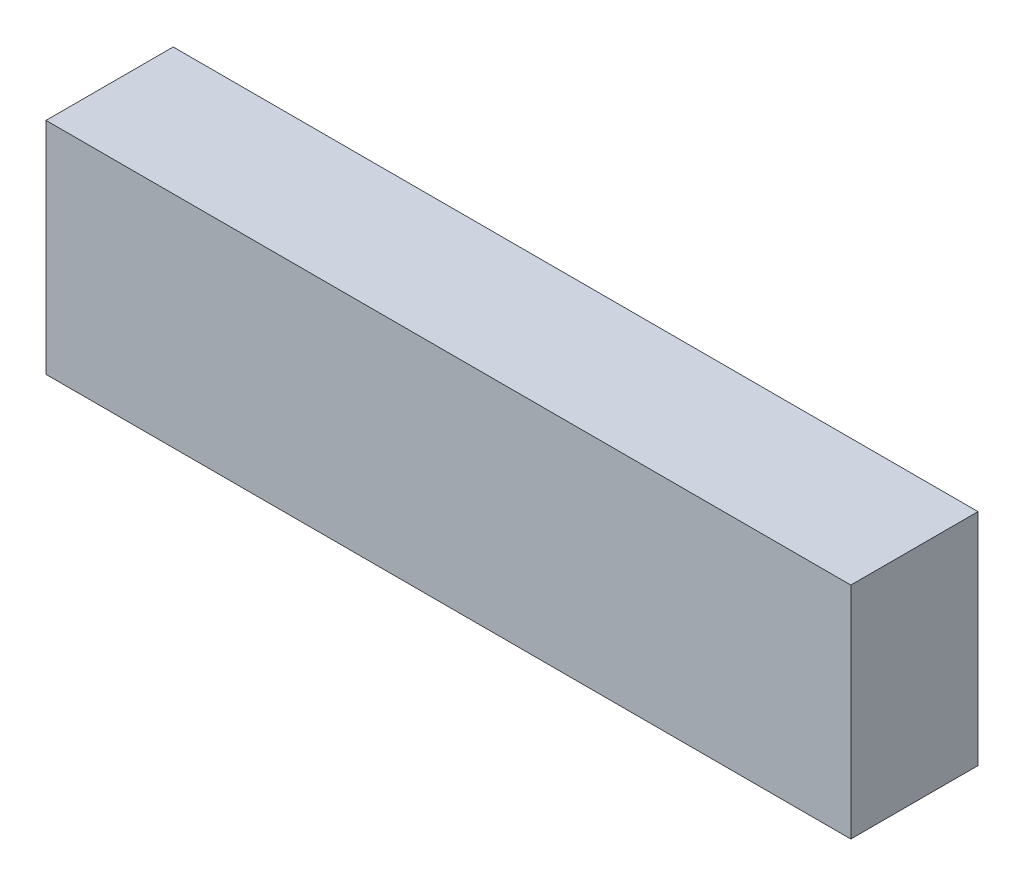
ISO-10303-21;
HEADER;
FILE_DESCRIPTION(('STEP AP214'),'2;1');
FILE_NAME('part.step','',(''),(''),'','','');
FILE_SCHEMA(('AUTOMOTIVE_DESIGN { 1 0 10303 214 1 1 1 1 }'));
ENDSEC;
DATA;
#1=APPLICATION_CONTEXT('core data for automotive mechanical design processes');
#2=APPLICATION_PROTOCOL_DEFINITION('international standard','automotive_design',2000,#1);
#3=PRODUCT_CONTEXT('',#1,'mechanical');
#4=PRODUCT('Part','Part','',(#3));
#5=PRODUCT_RELATED_PRODUCT_CATEGORY('part','',(#4));
#6=PRODUCT_DEFINITION_FORMATION('','',#4);
#7=PRODUCT_DEFINITION_CONTEXT('part definition',#1,'design');
#8=PRODUCT_DEFINITION('design','',#6,#7);
#9=PRODUCT_DEFINITION_SHAPE('','',#8);
#10=(LENGTH_UNIT() NAMED_UNIT(*) SI_UNIT(.MILLI.,.METRE.));
#11=(NAMED_UNIT(*) PLANE_ANGLE_UNIT() SI_UNIT($,.RADIAN.));
#12=(NAMED_UNIT(*) SI_UNIT($,.STERADIAN.) SOLID_ANGLE_UNIT());
#13=UNCERTAINTY_MEASURE_WITH_UNIT(LENGTH_MEASURE(1.E-05),#10,'distance_accuracy_value','');
#14=(GEOMETRIC_REPRESENTATION_CONTEXT(3) GLOBAL_UNCERTAINTY_ASSIGNED_CONTEXT((#13)) GLOBAL_UNIT_ASSIGNED_CONTEXT((#10,
#11,#12)) REPRESENTATION_CONTEXT('',''));
#15=CARTESIAN_POINT('',(0.,0.,0.));
#16=DIRECTION('',(0.,0.,1.));
#17=DIRECTION('',(1.,0.,0.));
#18=AXIS2_PLACEMENT_3D('',#15,#16,#17);
#19=CARTESIAN_POINT('',(7.86450000000038,30.19,7.25));
#20=DIRECTION('',(1.,0.,0.));
#21=DIRECTION('',(0.,1.,0.));
#22=AXIS2_PLACEMENT_3D('',#19,#20,#21);
#23=PLANE('',#22);
#24=DIRECTION('',(0.,-1.,0.));
#25=VECTOR('',#24,1.);
#26=CARTESIAN_POINT('',(7.86450000000038,30.19,0.));
#27=LINE('',#26,#25);
#28=CARTESIAN_POINT('',(7.86450000000038,30.19,0.));
#29=VERTEX_POINT('',#28);
#30=CARTESIAN_POINT('',(7.86450000000038,17.65,0.));
#31=VERTEX_POINT('',#30);
#32=EDGE_CURVE('E149',#29,#31,#27,.T.);
#33=ORIENTED_EDGE('',*,*,#32,.T.);
#34=DIRECTION('',(0.,0.,-1.));
#35=VECTOR('',#34,1.);
#36=CARTESIAN_POINT('',(7.86450000000038,17.65,7.25));
#37=LINE('',#36,#35);
#38=CARTESIAN_POINT('',(7.86450000000038,17.65,7.25));
#39=VERTEX_POINT('',#38);
#40=EDGE_CURVE('E11',#39,#31,#37,.T.);
#41=ORIENTED_EDGE('',*,*,#40,.F.);
#42=DIRECTION('',(0.,-1.,0.));
#43=VECTOR('',#42,1.);
#44=CARTESIAN_POINT('',(7.86450000000038,30.19,7.25));
#45=LINE('',#44,#43);
#46=CARTESIAN_POINT('',(7.86450000000038,30.19,7.25));
#47=VERTEX_POINT('',#46);
#48=EDGE_CURVE('E140',#47,#39,#45,.T.);
#49=ORIENTED_EDGE('',*,*,#48,.F.);
#50=DIRECTION('',(0.,0.,-1.));
#51=VECTOR('',#50,1.);
#52=CARTESIAN_POINT('',(7.86450000000038,30.19,7.25));
#53=LINE('',#52,#51);
#54=EDGE_CURVE('E55',#47,#29,#53,.T.);
#55=ORIENTED_EDGE('',*,*,#54,.T.);
#56=EDGE_LOOP('',(#33,#41,#49,#55));
#57=FACE_BOUND('',#56,.T.);
#58=ADVANCED_FACE('F32',(#57),#23,.F.);
#59=CARTESIAN_POINT('',(7.86450000000038,17.65,7.25));
#60=DIRECTION('',(0.,1.,0.));
#61=DIRECTION('',(0.,0.,1.));
#62=AXIS2_PLACEMENT_3D('',#59,#60,#61);
#63=PLANE('',#62);
#64=DIRECTION('',(1.,0.,0.));
#65=VECTOR('',#64,1.);
#66=CARTESIAN_POINT('',(7.86450000000038,17.65,0.));
#67=LINE('',#66,#65);
#68=CARTESIAN_POINT('',(53.7445000000004,17.65,0.));
#69=VERTEX_POINT('',#68);
#70=EDGE_CURVE('E151',#31,#69,#67,.T.);
#71=ORIENTED_EDGE('',*,*,#70,.T.);
#72=DIRECTION('',(0.,0.,-1.));
#73=VECTOR('',#72,1.);
#74=CARTESIAN_POINT('',(53.7445000000004,17.65,7.25));
#75=LINE('',#74,#73);
#76=CARTESIAN_POINT('',(53.7445000000004,17.65,7.25));
#77=VERTEX_POINT('',#76);
#78=EDGE_CURVE('E39',#77,#69,#75,.T.);
#79=ORIENTED_EDGE('',*,*,#78,.F.);
#80=DIRECTION('',(1.,0.,0.));
#81=VECTOR('',#80,1.);
#82=CARTESIAN_POINT('',(7.86450000000038,17.65,7.25));
#83=LINE('',#82,#81);
#84=EDGE_CURVE('E81',#39,#77,#83,.T.);
#85=ORIENTED_EDGE('',*,*,#84,.F.);
#86=ORIENTED_EDGE('',*,*,#40,.T.);
#87=EDGE_LOOP('',(#71,#79,#85,#86));
#88=FACE_BOUND('',#87,.T.);
#89=ADVANCED_FACE('F166',(#88),#63,.F.);
#90=CARTESIAN_POINT('',(53.7445000000004,30.19,7.25));
#91=DIRECTION('',(1.,0.,0.));
#92=DIRECTION('',(0.,0.,-1.));
#93=AXIS2_PLACEMENT_3D('',#90,#91,#92);
#94=PLANE('',#93);
#95=DIRECTION('',(0.,-1.,0.));
#96=VECTOR('',#95,1.);
#97=CARTESIAN_POINT('',(53.7445000000004,30.19,0.));
#98=LINE('',#97,#96);
#99=CARTESIAN_POINT('',(53.7445000000004,30.19,0.));
#100=VERTEX_POINT('',#99);
#101=EDGE_CURVE('E155',#100,#69,#98,.T.);
#102=ORIENTED_EDGE('',*,*,#101,.F.);
#103=DIRECTION('',(0.,0.,-1.));
#104=VECTOR('',#103,1.);
#105=CARTESIAN_POINT('',(53.7445000000004,30.19,7.25));
#106=LINE('',#105,#104);
#107=CARTESIAN_POINT('',(53.7445000000004,30.19,7.25));
#108=VERTEX_POINT('',#107);
#109=EDGE_CURVE('E161',#108,#100,#106,.T.);
#110=ORIENTED_EDGE('',*,*,#109,.F.);
#111=DIRECTION('',(0.,-1.,0.));
#112=VECTOR('',#111,1.);
#113=CARTESIAN_POINT('',(53.7445000000004,30.19,7.25));
#114=LINE('',#113,#112);
#115=EDGE_CURVE('E144',#108,#77,#114,.T.);
#116=ORIENTED_EDGE('',*,*,#115,.T.);
#117=ORIENTED_EDGE('',*,*,#78,.T.);
#118=EDGE_LOOP('',(#102,#110,#116,#117));
#119=FACE_BOUND('',#118,.T.);
#120=ADVANCED_FACE('F164',(#119),#94,.T.);
#121=CARTESIAN_POINT('',(7.86450000000038,30.19,7.25));
#122=DIRECTION('',(0.,1.,0.));
#123=DIRECTION('',(0.,0.,1.));
#124=AXIS2_PLACEMENT_3D('',#121,#122,#123);
#125=PLANE('',#124);
#126=DIRECTION('',(1.,0.,0.));
#127=VECTOR('',#126,1.);
#128=CARTESIAN_POINT('',(7.86450000000038,30.19,0.));
#129=LINE('',#128,#127);
#130=EDGE_CURVE('E142',#29,#100,#129,.T.);
#131=ORIENTED_EDGE('',*,*,#130,.F.);
#132=ORIENTED_EDGE('',*,*,#54,.F.);
#133=DIRECTION('',(1.,0.,0.));
#134=VECTOR('',#133,1.);
#135=CARTESIAN_POINT('',(7.86450000000038,30.19,7.25));
#136=LINE('',#135,#134);
#137=EDGE_CURVE('E147',#47,#108,#136,.T.);
#138=ORIENTED_EDGE('',*,*,#137,.T.);
#139=ORIENTED_EDGE('',*,*,#109,.T.);
#140=EDGE_LOOP('',(#131,#132,#138,#139));
#141=FACE_BOUND('',#140,.T.);
#142=ADVANCED_FACE('F170',(#141),#125,.T.);
#143=CARTESIAN_POINT('',(0.,0.,7.25));
#144=DIRECTION('',(0.,0.,1.));
#145=DIRECTION('',(1.,0.,0.));
#146=AXIS2_PLACEMENT_3D('',#143,#144,#145);
#147=PLANE('',#146);
#148=ORIENTED_EDGE('',*,*,#48,.T.);
#149=ORIENTED_EDGE('',*,*,#84,.T.);
#150=ORIENTED_EDGE('',*,*,#115,.F.);
#151=ORIENTED_EDGE('',*,*,#137,.F.);
#152=EDGE_LOOP('',(#148,#149,#150,#151));
#153=FACE_BOUND('',#152,.T.);
#154=ADVANCED_FACE('F173',(#153),#147,.T.);
#155=CARTESIAN_POINT('',(0.,0.,0.));
#156=DIRECTION('',(0.,0.,1.));
#157=DIRECTION('',(1.,0.,0.));
#158=AXIS2_PLACEMENT_3D('',#155,#156,#157);
#159=PLANE('',#158);
#160=DIRECTION('',(1.,0.,0.));
#161=VECTOR('',#160,1.);
#162=CARTESIAN_POINT('',(7.86450000000038,29.69,0.));
#163=LINE('',#162,#161);
#164=CARTESIAN_POINT('',(8.36450000000038,29.69,0.));
#165=VERTEX_POINT('',#164);
#166=CARTESIAN_POINT('',(53.2445000000004,29.69,0.));
#167=VERTEX_POINT('',#166);
#168=EDGE_CURVE('E125',#165,#167,#163,.T.);
#169=ORIENTED_EDGE('',*,*,#168,.F.);
#170=DIRECTION('',(0.,-1.,0.));
#171=VECTOR('',#170,1.);
#172=CARTESIAN_POINT('',(8.36450000000038,30.19,0.));
#173=LINE('',#172,#171);
#174=CARTESIAN_POINT('',(8.36450000000038,18.15,0.));
#175=VERTEX_POINT('',#174);
#176=EDGE_CURVE('E112',#165,#175,#173,.T.);
#177=ORIENTED_EDGE('',*,*,#176,.T.);
#178=DIRECTION('',(1.,0.,0.));
#179=VECTOR('',#178,1.);
#180=CARTESIAN_POINT('',(7.86450000000038,18.15,0.));
#181=LINE('',#180,#179);
#182=CARTESIAN_POINT('',(53.2445000000004,18.15,0.));
#183=VERTEX_POINT('',#182);
#184=EDGE_CURVE('E135',#175,#183,#181,.T.);
#185=ORIENTED_EDGE('',*,*,#184,.T.);
#186=DIRECTION('',(0.,-1.,0.));
#187=VECTOR('',#186,1.);
#188=CARTESIAN_POINT('',(53.2445000000004,30.19,0.));
#189=LINE('',#188,#187);
#190=EDGE_CURVE('E46',#167,#183,#189,.T.);
#191=ORIENTED_EDGE('',*,*,#190,.F.);
#192=EDGE_LOOP('',(#169,#177,#185,#191));
#193=FACE_BOUND('',#192,.T.);
#194=ORIENTED_EDGE('',*,*,#32,.F.);
#195=ORIENTED_EDGE('',*,*,#130,.T.);
#196=ORIENTED_EDGE('',*,*,#101,.T.);
#197=ORIENTED_EDGE('',*,*,#70,.F.);
#198=EDGE_LOOP('',(#194,#195,#196,#197));
#199=FACE_BOUND('',#198,.T.);
#200=ADVANCED_FACE('F169',(#193,#199),#159,.F.);
#201=CARTESIAN_POINT('',(8.36450000000038,30.19,7.25));
#202=DIRECTION('',(1.,0.,0.));
#203=DIRECTION('',(0.,1.,0.));
#204=AXIS2_PLACEMENT_3D('',#201,#202,#203);
#205=PLANE('',#204);
#206=ORIENTED_EDGE('',*,*,#176,.F.);
#207=DIRECTION('',(0.,0.,-1.));
#208=VECTOR('',#207,1.);
#209=CARTESIAN_POINT('',(8.36450000000038,29.69,7.25));
#210=LINE('',#209,#208);
#211=CARTESIAN_POINT('',(8.36450000000038,29.69,7.05));
#212=VERTEX_POINT('',#211);
#213=EDGE_CURVE('E105',#212,#165,#210,.T.);
#214=ORIENTED_EDGE('',*,*,#213,.F.);
#215=DIRECTION('',(0.,-1.,0.));
#216=VECTOR('',#215,1.);
#217=CARTESIAN_POINT('',(8.36450000000038,30.19,7.05));
#218=LINE('',#217,#216);
#219=CARTESIAN_POINT('',(8.36450000000038,18.15,7.05));
#220=VERTEX_POINT('',#219);
#221=EDGE_CURVE('E109',#212,#220,#218,.T.);
#222=ORIENTED_EDGE('',*,*,#221,.T.);
#223=DIRECTION('',(0.,0.,-1.));
#224=VECTOR('',#223,1.);
#225=CARTESIAN_POINT('',(8.36450000000038,18.15,7.25));
#226=LINE('',#225,#224);
#227=EDGE_CURVE('E152',#220,#175,#226,.T.);
#228=ORIENTED_EDGE('',*,*,#227,.T.);
#229=EDGE_LOOP('',(#206,#214,#222,#228));
#230=FACE_BOUND('',#229,.T.);
#231=ADVANCED_FACE('F107',(#230),#205,.T.);
#232=CARTESIAN_POINT('',(7.86450000000038,18.15,7.25));
#233=DIRECTION('',(0.,1.,0.));
#234=DIRECTION('',(0.,0.,1.));
#235=AXIS2_PLACEMENT_3D('',#232,#233,#234);
#236=PLANE('',#235);
#237=ORIENTED_EDGE('',*,*,#184,.F.);
#238=ORIENTED_EDGE('',*,*,#227,.F.);
#239=DIRECTION('',(1.,0.,0.));
#240=VECTOR('',#239,1.);
#241=CARTESIAN_POINT('',(7.86450000000038,18.15,7.05));
#242=LINE('',#241,#240);
#243=CARTESIAN_POINT('',(53.2445000000004,18.15,7.05));
#244=VERTEX_POINT('',#243);
#245=EDGE_CURVE('E124',#220,#244,#242,.T.);
#246=ORIENTED_EDGE('',*,*,#245,.T.);
#247=DIRECTION('',(0.,0.,-1.));
#248=VECTOR('',#247,1.);
#249=CARTESIAN_POINT('',(53.2445000000004,18.15,7.25));
#250=LINE('',#249,#248);
#251=EDGE_CURVE('E264',#244,#183,#250,.T.);
#252=ORIENTED_EDGE('',*,*,#251,.T.);
#253=EDGE_LOOP('',(#237,#238,#246,#252));
#254=FACE_BOUND('',#253,.T.);
#255=ADVANCED_FACE('F197',(#254),#236,.T.);
#256=CARTESIAN_POINT('',(53.2445000000004,30.19,7.25));
#257=DIRECTION('',(1.,0.,0.));
#258=DIRECTION('',(0.,0.,-1.));
#259=AXIS2_PLACEMENT_3D('',#256,#257,#258);
#260=PLANE('',#259);
#261=ORIENTED_EDGE('',*,*,#190,.T.);
#262=ORIENTED_EDGE('',*,*,#251,.F.);
#263=DIRECTION('',(0.,-1.,0.));
#264=VECTOR('',#263,1.);
#265=CARTESIAN_POINT('',(53.2445000000004,30.19,7.05));
#266=LINE('',#265,#264);
#267=CARTESIAN_POINT('',(53.2445000000004,29.69,7.05));
#268=VERTEX_POINT('',#267);
#269=EDGE_CURVE('E129',#268,#244,#266,.T.);
#270=ORIENTED_EDGE('',*,*,#269,.F.);
#271=DIRECTION('',(0.,0.,-1.));
#272=VECTOR('',#271,1.);
#273=CARTESIAN_POINT('',(53.2445000000004,29.69,7.25));
#274=LINE('',#273,#272);
#275=EDGE_CURVE('E117',#268,#167,#274,.T.);
#276=ORIENTED_EDGE('',*,*,#275,.T.);
#277=EDGE_LOOP('',(#261,#262,#270,#276));
#278=FACE_BOUND('',#277,.T.);
#279=ADVANCED_FACE('F194',(#278),#260,.F.);
#280=CARTESIAN_POINT('',(7.86450000000038,29.69,7.25));
#281=DIRECTION('',(0.,1.,0.));
#282=DIRECTION('',(0.,0.,1.));
#283=AXIS2_PLACEMENT_3D('',#280,#281,#282);
#284=PLANE('',#283);
#285=ORIENTED_EDGE('',*,*,#168,.T.);
#286=ORIENTED_EDGE('',*,*,#275,.F.);
#287=DIRECTION('',(1.,0.,0.));
#288=VECTOR('',#287,1.);
#289=CARTESIAN_POINT('',(7.86450000000038,29.69,7.05));
#290=LINE('',#289,#288);
#291=EDGE_CURVE('E118',#212,#268,#290,.T.);
#292=ORIENTED_EDGE('',*,*,#291,.F.);
#293=ORIENTED_EDGE('',*,*,#213,.T.);
#294=EDGE_LOOP('',(#285,#286,#292,#293));
#295=FACE_BOUND('',#294,.T.);
#296=ADVANCED_FACE('F127',(#295),#284,.F.);
#297=CARTESIAN_POINT('',(0.,0.,7.05));
#298=DIRECTION('',(0.,0.,1.));
#299=DIRECTION('',(1.,0.,0.));
#300=AXIS2_PLACEMENT_3D('',#297,#298,#299);
#301=PLANE('',#300);
#302=ORIENTED_EDGE('',*,*,#221,.F.);
#303=ORIENTED_EDGE('',*,*,#291,.T.);
#304=ORIENTED_EDGE('',*,*,#269,.T.);
#305=ORIENTED_EDGE('',*,*,#245,.F.);
#306=EDGE_LOOP('',(#302,#303,#304,#305));
#307=FACE_BOUND('',#306,.T.);
#308=ADVANCED_FACE('F122',(#307),#301,.F.);
#309=CLOSED_SHELL('',(#58,#89,#120,#142,#154,#200,#231,#255,#279,#296,#308));
#310=MANIFOLD_SOLID_BREP('B2',#309);
#311=ADVANCED_BREP_SHAPE_REPRESENTATION('',(#18,#310),#14);
#312=SHAPE_DEFINITION_REPRESENTATION(#9,#311);
ENDSEC;
END-ISO-10303-21;
